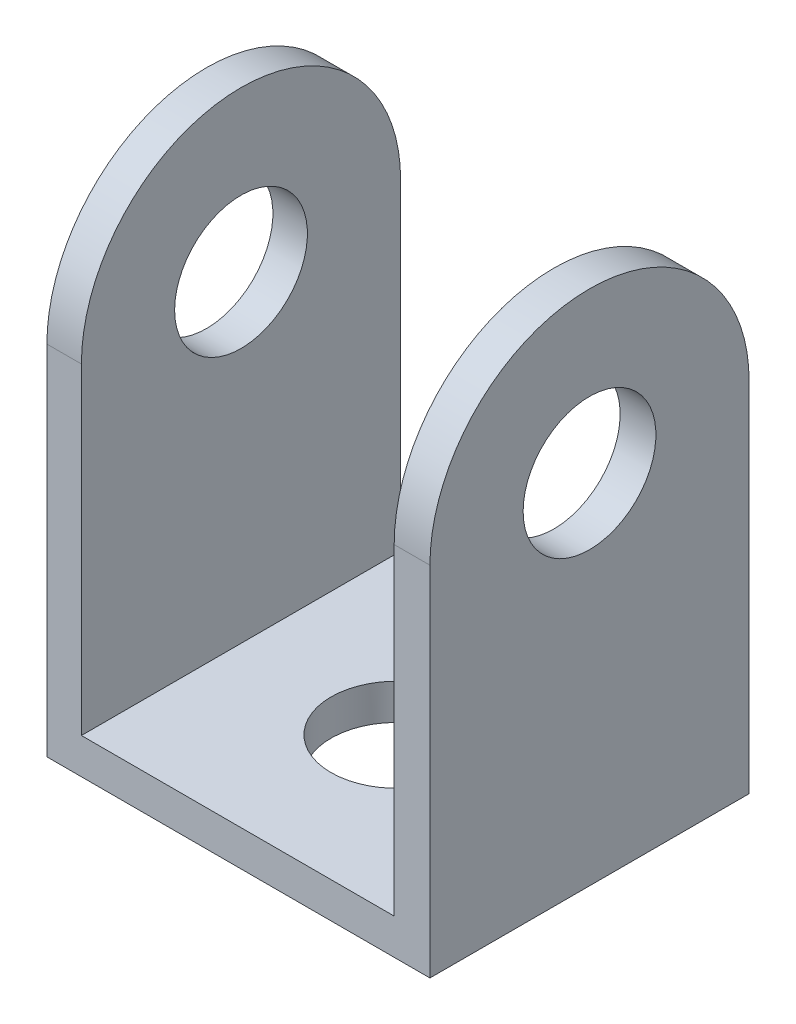
ISO-10303-21;
HEADER;
FILE_DESCRIPTION(('STEP AP214'),'2;1');
FILE_NAME('part.step','',(''),(''),'','','');
FILE_SCHEMA(('AUTOMOTIVE_DESIGN { 1 0 10303 214 1 1 1 1 }'));
ENDSEC;
DATA;
#1=APPLICATION_CONTEXT('core data for automotive mechanical design processes');
#2=APPLICATION_PROTOCOL_DEFINITION('international standard','automotive_design',2000,#1);
#3=PRODUCT_CONTEXT('',#1,'mechanical');
#4=PRODUCT('Part','Part','',(#3));
#5=PRODUCT_RELATED_PRODUCT_CATEGORY('part','',(#4));
#6=PRODUCT_DEFINITION_FORMATION('','',#4);
#7=PRODUCT_DEFINITION_CONTEXT('part definition',#1,'design');
#8=PRODUCT_DEFINITION('design','',#6,#7);
#9=PRODUCT_DEFINITION_SHAPE('','',#8);
#10=(LENGTH_UNIT() NAMED_UNIT(*) SI_UNIT(.MILLI.,.METRE.));
#11=(NAMED_UNIT(*) PLANE_ANGLE_UNIT() SI_UNIT($,.RADIAN.));
#12=(NAMED_UNIT(*) SI_UNIT($,.STERADIAN.) SOLID_ANGLE_UNIT());
#13=UNCERTAINTY_MEASURE_WITH_UNIT(LENGTH_MEASURE(1.E-05),#10,'distance_accuracy_value','');
#14=(GEOMETRIC_REPRESENTATION_CONTEXT(3) GLOBAL_UNCERTAINTY_ASSIGNED_CONTEXT((#13)) GLOBAL_UNIT_ASSIGNED_CONTEXT((#10,
#11,#12)) REPRESENTATION_CONTEXT('',''));
#15=CARTESIAN_POINT('',(0.,0.,0.));
#16=DIRECTION('',(0.,0.,1.));
#17=DIRECTION('',(1.,0.,0.));
#18=AXIS2_PLACEMENT_3D('',#15,#16,#17);
#19=CARTESIAN_POINT('',(19.05,0.,0.));
#20=DIRECTION('',(-1.,0.,0.));
#21=DIRECTION('',(0.,0.,1.));
#22=AXIS2_PLACEMENT_3D('',#19,#20,#21);
#23=CYLINDRICAL_SURFACE('',#22,7.9375);
#24=DIRECTION('',(-1.,0.,0.));
#25=VECTOR('',#24,1.);
#26=CARTESIAN_POINT('',(19.05,0.,-7.9375));
#27=LINE('',#26,#25);
#28=CARTESIAN_POINT('',(19.05,0.,-7.9375));
#29=VERTEX_POINT('',#28);
#30=CARTESIAN_POINT('',(17.272,0.,-7.9375));
#31=VERTEX_POINT('',#30);
#32=EDGE_CURVE('E51',#29,#31,#27,.T.);
#33=ORIENTED_EDGE('',*,*,#32,.T.);
#34=CARTESIAN_POINT('',(17.272,0.,0.));
#35=DIRECTION('',(1.,0.,0.));
#36=DIRECTION('',(0.,0.,-1.));
#37=AXIS2_PLACEMENT_3D('',#34,#35,#36);
#38=CIRCLE('',#37,7.9375);
#39=CARTESIAN_POINT('',(17.272,0.,7.9375));
#40=VERTEX_POINT('',#39);
#41=EDGE_CURVE('E148',#31,#40,#38,.T.);
#42=ORIENTED_EDGE('',*,*,#41,.T.);
#43=DIRECTION('',(-1.,0.,0.));
#44=VECTOR('',#43,1.);
#45=CARTESIAN_POINT('',(19.05,0.,7.9375));
#46=LINE('',#45,#44);
#47=CARTESIAN_POINT('',(19.05,0.,7.9375));
#48=VERTEX_POINT('',#47);
#49=EDGE_CURVE('E176',#48,#40,#46,.T.);
#50=ORIENTED_EDGE('',*,*,#49,.F.);
#51=CARTESIAN_POINT('',(19.05,0.,0.));
#52=DIRECTION('',(1.,0.,0.));
#53=DIRECTION('',(0.,0.,-1.));
#54=AXIS2_PLACEMENT_3D('',#51,#52,#53);
#55=CIRCLE('',#54,7.9375);
#56=EDGE_CURVE('E96',#29,#48,#55,.T.);
#57=ORIENTED_EDGE('',*,*,#56,.F.);
#58=EDGE_LOOP('',(#33,#42,#50,#57));
#59=FACE_BOUND('',#58,.T.);
#60=ADVANCED_FACE('F42',(#59),#23,.T.);
#61=CARTESIAN_POINT('',(19.05,0.,0.));
#62=DIRECTION('',(-1.,0.,0.));
#63=DIRECTION('',(0.,0.,1.));
#64=AXIS2_PLACEMENT_3D('',#61,#62,#63);
#65=CYLINDRICAL_SURFACE('',#64,3.302);
#66=CARTESIAN_POINT('',(17.272,0.,0.));
#67=DIRECTION('',(1.,0.,0.));
#68=DIRECTION('',(0.,0.,-1.));
#69=AXIS2_PLACEMENT_3D('',#66,#67,#68);
#70=CIRCLE('',#69,3.302);
#71=CARTESIAN_POINT('',(17.272,0.,3.302));
#72=VERTEX_POINT('',#71);
#73=EDGE_CURVE('E138',#72,#72,#70,.T.);
#74=CARTESIAN_POINT('',(19.05,0.,0.));
#75=DIRECTION('',(1.,0.,0.));
#76=DIRECTION('',(0.,0.,-1.));
#77=AXIS2_PLACEMENT_3D('',#74,#75,#76);
#78=CIRCLE('',#77,3.302);
#79=CARTESIAN_POINT('',(19.05,0.,3.302));
#80=VERTEX_POINT('',#79);
#81=EDGE_CURVE('E159',#80,#80,#78,.T.);
#82=CARTESIAN_POINT('',(17.272,0.,3.302));
#83=CARTESIAN_POINT('',(17.2905208333333,0.,3.302));
#84=CARTESIAN_POINT('',(17.3090416666667,0.,3.302));
#85=CARTESIAN_POINT('',(17.3460833333333,0.,3.302));
#86=CARTESIAN_POINT('',(17.3646041666667,0.,3.302));
#87=CARTESIAN_POINT('',(17.4016458333333,0.,3.302));
#88=CARTESIAN_POINT('',(17.4201666666667,0.,3.302));
#89=CARTESIAN_POINT('',(17.4572083333333,0.,3.302));
#90=CARTESIAN_POINT('',(17.4757291666667,0.,3.302));
#91=CARTESIAN_POINT('',(17.5127708333333,0.,3.302));
#92=CARTESIAN_POINT('',(17.5312916666667,0.,3.302));
#93=CARTESIAN_POINT('',(17.5683333333333,0.,3.302));
#94=CARTESIAN_POINT('',(17.5868541666667,0.,3.302));
#95=CARTESIAN_POINT('',(17.6238958333333,0.,3.302));
#96=CARTESIAN_POINT('',(17.6424166666667,0.,3.302));
#97=CARTESIAN_POINT('',(17.6794583333333,0.,3.302));
#98=CARTESIAN_POINT('',(17.6979791666667,0.,3.302));
#99=CARTESIAN_POINT('',(17.7350208333333,0.,3.302));
#100=CARTESIAN_POINT('',(17.7535416666667,0.,3.302));
#101=CARTESIAN_POINT('',(17.7905833333333,0.,3.302));
#102=CARTESIAN_POINT('',(17.8091041666667,0.,3.302));
#103=CARTESIAN_POINT('',(17.8461458333333,0.,3.302));
#104=CARTESIAN_POINT('',(17.8646666666667,0.,3.302));
#105=CARTESIAN_POINT('',(17.9017083333333,0.,3.302));
#106=CARTESIAN_POINT('',(17.9202291666667,0.,3.302));
#107=CARTESIAN_POINT('',(17.9572708333333,0.,3.302));
#108=CARTESIAN_POINT('',(17.9757916666667,0.,3.302));
#109=CARTESIAN_POINT('',(18.0128333333333,0.,3.302));
#110=CARTESIAN_POINT('',(18.0313541666667,0.,3.302));
#111=CARTESIAN_POINT('',(18.0683958333333,0.,3.302));
#112=CARTESIAN_POINT('',(18.0869166666667,0.,3.302));
#113=CARTESIAN_POINT('',(18.1239583333333,0.,3.302));
#114=CARTESIAN_POINT('',(18.1424791666667,0.,3.302));
#115=CARTESIAN_POINT('',(18.1795208333333,0.,3.302));
#116=CARTESIAN_POINT('',(18.1980416666667,0.,3.302));
#117=CARTESIAN_POINT('',(18.2350833333333,0.,3.302));
#118=CARTESIAN_POINT('',(18.2536041666667,0.,3.302));
#119=CARTESIAN_POINT('',(18.2906458333333,0.,3.302));
#120=CARTESIAN_POINT('',(18.3091666666667,0.,3.302));
#121=CARTESIAN_POINT('',(18.3462083333333,0.,3.302));
#122=CARTESIAN_POINT('',(18.3647291666667,0.,3.302));
#123=CARTESIAN_POINT('',(18.4017708333333,0.,3.302));
#124=CARTESIAN_POINT('',(18.4202916666667,0.,3.302));
#125=CARTESIAN_POINT('',(18.4573333333333,0.,3.302));
#126=CARTESIAN_POINT('',(18.4758541666667,0.,3.302));
#127=CARTESIAN_POINT('',(18.5128958333333,0.,3.302));
#128=CARTESIAN_POINT('',(18.5314166666667,0.,3.302));
#129=CARTESIAN_POINT('',(18.5684583333333,0.,3.302));
#130=CARTESIAN_POINT('',(18.5869791666667,0.,3.302));
#131=CARTESIAN_POINT('',(18.6240208333333,0.,3.302));
#132=CARTESIAN_POINT('',(18.6425416666667,0.,3.302));
#133=CARTESIAN_POINT('',(18.6795833333333,0.,3.302));
#134=CARTESIAN_POINT('',(18.6981041666667,0.,3.302));
#135=CARTESIAN_POINT('',(18.7351458333333,0.,3.302));
#136=CARTESIAN_POINT('',(18.7536666666667,0.,3.302));
#137=CARTESIAN_POINT('',(18.7907083333333,0.,3.302));
#138=CARTESIAN_POINT('',(18.8092291666667,0.,3.302));
#139=CARTESIAN_POINT('',(18.8462708333333,0.,3.302));
#140=CARTESIAN_POINT('',(18.8647916666667,0.,3.302));
#141=CARTESIAN_POINT('',(18.9018333333333,0.,3.302));
#142=CARTESIAN_POINT('',(18.9203541666667,0.,3.302));
#143=CARTESIAN_POINT('',(18.9573958333333,0.,3.302));
#144=CARTESIAN_POINT('',(18.9759166666667,0.,3.302));
#145=CARTESIAN_POINT('',(19.0129583333333,0.,3.302));
#146=CARTESIAN_POINT('',(19.0314791666667,0.,3.302));
#147=CARTESIAN_POINT('',(19.05,0.,3.302));
#148=B_SPLINE_CURVE_WITH_KNOTS('',3,(#82,#83,#84,#85,#86,#87,#88,#89,#90,#91,#92,#93,#94,#95,
#96,#97,#98,#99,#100,#101,#102,#103,#104,#105,#106,#107,#108,#109,#110,#111,#112,#113,#114,#115,
#116,#117,#118,#119,#120,#121,#122,#123,#124,#125,#126,#127,#128,#129,#130,#131,#132,#133,#134,
#135,#136,#137,#138,#139,#140,#141,#142,#143,#144,#145,#146,#147),.UNSPECIFIED.,.F.,.F.,(4,2,2,
2,2,2,2,2,2,2,2,2,2,2,2,2,2,2,2,2,2,2,2,2,2,2,2,2,2,2,2,2,4),(0.,0.0555625000000018,0.111125,
0.166687500000002,0.22225,0.277812500000002,0.333375,0.388937500000002,0.4445,0.500062500000002,
0.555625000000001,0.611187500000002,0.666750000000001,0.722312500000002,0.777875000000001,
0.833437500000003,0.889000000000001,0.944562499999999,1.000125,1.0556875,1.11125,1.1668125,
1.222375,1.2779375,1.3335,1.3890625,1.444625,1.5001875,1.55575,1.6113125,1.666875,1.7224375,
1.778),.UNSPECIFIED.);
#149=EDGE_CURVE('BSEAM207',#72,#80,#148,.T.);
#150=ORIENTED_EDGE('',*,*,#73,.F.);
#151=ORIENTED_EDGE('',*,*,#81,.T.);
#152=ORIENTED_EDGE('',*,*,#149,.T.);
#153=ORIENTED_EDGE('',*,*,#149,.F.);
#154=EDGE_LOOP('',(#150,#152,#151,#153));
#155=FACE_BOUND('',#154,.T.);
#156=ADVANCED_FACE('F207',(#155),#65,.F.);
#157=CARTESIAN_POINT('',(19.05,0.,-7.9375));
#158=DIRECTION('',(0.,0.,1.));
#159=DIRECTION('',(0.,-1.,0.));
#160=AXIS2_PLACEMENT_3D('',#157,#158,#159);
#161=PLANE('',#160);
#162=DIRECTION('',(1.,0.,0.));
#163=VECTOR('',#162,1.);
#164=CARTESIAN_POINT('',(19.05,-16.002,-7.9375));
#165=LINE('',#164,#163);
#166=CARTESIAN_POINT('',(1.71697331779427,-16.002,-7.9375));
#167=VERTEX_POINT('',#166);
#168=CARTESIAN_POINT('',(17.272,-16.002,-7.9375));
#169=VERTEX_POINT('',#168);
#170=EDGE_CURVE('E119',#167,#169,#165,.T.);
#171=ORIENTED_EDGE('',*,*,#170,.T.);
#172=DIRECTION('',(0.,1.,0.));
#173=VECTOR('',#172,1.);
#174=CARTESIAN_POINT('',(17.272,0.,-7.9375));
#175=LINE('',#174,#173);
#176=EDGE_CURVE('E129',#169,#31,#175,.T.);
#177=ORIENTED_EDGE('',*,*,#176,.T.);
#178=ORIENTED_EDGE('',*,*,#32,.F.);
#179=DIRECTION('',(0.,1.,0.));
#180=VECTOR('',#179,1.);
#181=CARTESIAN_POINT('',(19.05,0.,-7.9375));
#182=LINE('',#181,#180);
#183=CARTESIAN_POINT('',(19.05,-17.78,-7.9375));
#184=VERTEX_POINT('',#183);
#185=EDGE_CURVE('E152',#184,#29,#182,.T.);
#186=ORIENTED_EDGE('',*,*,#185,.F.);
#187=DIRECTION('',(-1.,0.,0.));
#188=VECTOR('',#187,1.);
#189=CARTESIAN_POINT('',(19.05,-17.78,-7.9375));
#190=LINE('',#189,#188);
#191=CARTESIAN_POINT('',(0.,-17.78,-7.9375));
#192=VERTEX_POINT('',#191);
#193=EDGE_CURVE('E162',#184,#192,#190,.T.);
#194=ORIENTED_EDGE('',*,*,#193,.T.);
#195=DIRECTION('',(0.,1.,0.));
#196=VECTOR('',#195,1.);
#197=CARTESIAN_POINT('',(0.,0.,-7.9375));
#198=LINE('',#197,#196);
#199=CARTESIAN_POINT('',(0.,0.,-7.9375));
#200=VERTEX_POINT('',#199);
#201=EDGE_CURVE('E128',#192,#200,#198,.T.);
#202=ORIENTED_EDGE('',*,*,#201,.T.);
#203=CARTESIAN_POINT('',(1.71697331779427,0.,-7.9375));
#204=VERTEX_POINT('',#203);
#205=EDGE_CURVE('E137',#204,#200,#27,.T.);
#206=ORIENTED_EDGE('',*,*,#205,.F.);
#207=DIRECTION('',(0.,-1.,0.));
#208=VECTOR('',#207,1.);
#209=CARTESIAN_POINT('',(1.71697331779427,0.,-7.9375));
#210=LINE('',#209,#208);
#211=EDGE_CURVE('E132',#204,#167,#210,.T.);
#212=ORIENTED_EDGE('',*,*,#211,.T.);
#213=EDGE_LOOP('',(#171,#177,#178,#186,#194,#202,#206,#212));
#214=FACE_BOUND('',#213,.T.);
#215=ADVANCED_FACE('F44',(#214),#161,.F.);
#216=CARTESIAN_POINT('',(1.71697331779427,0.,7.9375));
#217=VERTEX_POINT('',#216);
#218=CARTESIAN_POINT('',(0.,0.,7.9375));
#219=VERTEX_POINT('',#218);
#220=EDGE_CURVE('E175',#217,#219,#46,.T.);
#221=ORIENTED_EDGE('',*,*,#220,.F.);
#222=CARTESIAN_POINT('',(1.71697331779427,0.,0.));
#223=DIRECTION('',(-1.,0.,0.));
#224=DIRECTION('',(0.,0.,1.));
#225=AXIS2_PLACEMENT_3D('',#222,#223,#224);
#226=CIRCLE('',#225,7.9375);
#227=EDGE_CURVE('E58',#217,#204,#226,.T.);
#228=ORIENTED_EDGE('',*,*,#227,.T.);
#229=ORIENTED_EDGE('',*,*,#205,.T.);
#230=CARTESIAN_POINT('',(0.,0.,0.));
#231=DIRECTION('',(1.,0.,0.));
#232=DIRECTION('',(0.,0.,-1.));
#233=AXIS2_PLACEMENT_3D('',#230,#231,#232);
#234=CIRCLE('',#233,7.9375);
#235=EDGE_CURVE('E164',#200,#219,#234,.T.);
#236=ORIENTED_EDGE('',*,*,#235,.T.);
#237=EDGE_LOOP('',(#221,#228,#229,#236));
#238=FACE_BOUND('',#237,.T.);
#239=ADVANCED_FACE('F208',(#238),#23,.T.);
#240=CARTESIAN_POINT('',(19.05,0.,7.9375));
#241=DIRECTION('',(0.,0.,-1.));
#242=DIRECTION('',(0.,1.,0.));
#243=AXIS2_PLACEMENT_3D('',#240,#241,#242);
#244=PLANE('',#243);
#245=ORIENTED_EDGE('',*,*,#49,.T.);
#246=DIRECTION('',(0.,-1.,0.));
#247=VECTOR('',#246,1.);
#248=CARTESIAN_POINT('',(17.272,0.,7.9375));
#249=LINE('',#248,#247);
#250=CARTESIAN_POINT('',(17.272,-16.002,7.9375));
#251=VERTEX_POINT('',#250);
#252=EDGE_CURVE('E141',#40,#251,#249,.T.);
#253=ORIENTED_EDGE('',*,*,#252,.T.);
#254=DIRECTION('',(-1.,0.,0.));
#255=VECTOR('',#254,1.);
#256=CARTESIAN_POINT('',(19.05,-16.002,7.9375));
#257=LINE('',#256,#255);
#258=CARTESIAN_POINT('',(1.71697331779427,-16.002,7.9375));
#259=VERTEX_POINT('',#258);
#260=EDGE_CURVE('E11',#251,#259,#257,.T.);
#261=ORIENTED_EDGE('',*,*,#260,.T.);
#262=DIRECTION('',(0.,1.,0.));
#263=VECTOR('',#262,1.);
#264=CARTESIAN_POINT('',(1.71697331779427,0.,7.9375));
#265=LINE('',#264,#263);
#266=EDGE_CURVE('E133',#259,#217,#265,.T.);
#267=ORIENTED_EDGE('',*,*,#266,.T.);
#268=ORIENTED_EDGE('',*,*,#220,.T.);
#269=DIRECTION('',(0.,-1.,0.));
#270=VECTOR('',#269,1.);
#271=CARTESIAN_POINT('',(0.,0.,7.9375));
#272=LINE('',#271,#270);
#273=CARTESIAN_POINT('',(0.,-17.78,7.9375));
#274=VERTEX_POINT('',#273);
#275=EDGE_CURVE('E167',#219,#274,#272,.T.);
#276=ORIENTED_EDGE('',*,*,#275,.T.);
#277=DIRECTION('',(-1.,0.,0.));
#278=VECTOR('',#277,1.);
#279=CARTESIAN_POINT('',(19.05,-17.78,7.9375));
#280=LINE('',#279,#278);
#281=CARTESIAN_POINT('',(19.05,-17.78,7.9375));
#282=VERTEX_POINT('',#281);
#283=EDGE_CURVE('E173',#282,#274,#280,.T.);
#284=ORIENTED_EDGE('',*,*,#283,.F.);
#285=DIRECTION('',(0.,-1.,0.));
#286=VECTOR('',#285,1.);
#287=CARTESIAN_POINT('',(19.05,0.,7.9375));
#288=LINE('',#287,#286);
#289=EDGE_CURVE('E156',#48,#282,#288,.T.);
#290=ORIENTED_EDGE('',*,*,#289,.F.);
#291=EDGE_LOOP('',(#245,#253,#261,#267,#268,#276,#284,#290));
#292=FACE_BOUND('',#291,.T.);
#293=ADVANCED_FACE('F218',(#292),#244,.F.);
#294=CARTESIAN_POINT('',(19.05,-17.78,0.));
#295=DIRECTION('',(0.,1.,0.));
#296=DIRECTION('',(0.,0.,1.));
#297=AXIS2_PLACEMENT_3D('',#294,#295,#296);
#298=PLANE('',#297);
#299=CARTESIAN_POINT('',(9.525,-17.78,0.0634999999999993));
#300=DIRECTION('',(0.,1.,0.));
#301=DIRECTION('',(0.,0.,1.));
#302=AXIS2_PLACEMENT_3D('',#299,#300,#301);
#303=CIRCLE('',#302,3.2639);
#304=CARTESIAN_POINT('',(9.525,-17.78,3.3274));
#305=VERTEX_POINT('',#304);
#306=EDGE_CURVE('E187',#305,#305,#303,.T.);
#307=ORIENTED_EDGE('',*,*,#306,.T.);
#308=EDGE_LOOP('',(#307));
#309=FACE_BOUND('',#308,.T.);
#310=DIRECTION('',(0.,0.,-1.));
#311=VECTOR('',#310,1.);
#312=CARTESIAN_POINT('',(0.,-17.78,0.));
#313=LINE('',#312,#311);
#314=EDGE_CURVE('E88',#274,#192,#313,.T.);
#315=ORIENTED_EDGE('',*,*,#314,.T.);
#316=ORIENTED_EDGE('',*,*,#193,.F.);
#317=DIRECTION('',(0.,0.,-1.));
#318=VECTOR('',#317,1.);
#319=CARTESIAN_POINT('',(19.05,-17.78,0.));
#320=LINE('',#319,#318);
#321=EDGE_CURVE('E67',#282,#184,#320,.T.);
#322=ORIENTED_EDGE('',*,*,#321,.F.);
#323=ORIENTED_EDGE('',*,*,#283,.T.);
#324=EDGE_LOOP('',(#315,#316,#322,#323));
#325=FACE_BOUND('',#324,.T.);
#326=ADVANCED_FACE('F224',(#309,#325),#298,.F.);
#327=CARTESIAN_POINT('',(1.71697331779427,0.,0.));
#328=DIRECTION('',(-1.,0.,0.));
#329=DIRECTION('',(0.,0.,1.));
#330=AXIS2_PLACEMENT_3D('',#327,#328,#329);
#331=CIRCLE('',#330,3.302);
#332=CARTESIAN_POINT('',(1.71697331779427,0.,3.302));
#333=VERTEX_POINT('',#332);
#334=EDGE_CURVE('E180',#333,#333,#331,.T.);
#335=CARTESIAN_POINT('',(0.,0.,0.));
#336=DIRECTION('',(1.,0.,0.));
#337=DIRECTION('',(0.,0.,-1.));
#338=AXIS2_PLACEMENT_3D('',#335,#336,#337);
#339=CIRCLE('',#338,3.302);
#340=CARTESIAN_POINT('',(0.,0.,3.302));
#341=VERTEX_POINT('',#340);
#342=EDGE_CURVE('E154',#341,#341,#339,.T.);
#343=CARTESIAN_POINT('',(1.71697331779427,0.,3.302));
#344=CARTESIAN_POINT('',(1.69908817906724,0.,3.302));
#345=CARTESIAN_POINT('',(1.68120304034022,0.,3.302));
#346=CARTESIAN_POINT('',(1.64543276288617,0.,3.302));
#347=CARTESIAN_POINT('',(1.62754762415915,0.,3.302));
#348=CARTESIAN_POINT('',(1.5917773467051,0.,3.302));
#349=CARTESIAN_POINT('',(1.57389220797808,0.,3.302));
#350=CARTESIAN_POINT('',(1.53812193052403,0.,3.302));
#351=CARTESIAN_POINT('',(1.52023679179701,0.,3.302));
#352=CARTESIAN_POINT('',(1.48446651434296,0.,3.302));
#353=CARTESIAN_POINT('',(1.46658137561594,0.,3.302));
#354=CARTESIAN_POINT('',(1.43081109816189,0.,3.302));
#355=CARTESIAN_POINT('',(1.41292595943487,0.,3.302));
#356=CARTESIAN_POINT('',(1.37715568198082,0.,3.302));
#357=CARTESIAN_POINT('',(1.35927054325379,0.,3.302));
#358=CARTESIAN_POINT('',(1.32350026579975,0.,3.302));
#359=CARTESIAN_POINT('',(1.30561512707272,0.,3.302));
#360=CARTESIAN_POINT('',(1.26984484961868,0.,3.302));
#361=CARTESIAN_POINT('',(1.25195971089165,0.,3.302));
#362=CARTESIAN_POINT('',(1.21618943343761,0.,3.302));
#363=CARTESIAN_POINT('',(1.19830429471058,0.,3.302));
#364=CARTESIAN_POINT('',(1.16253401725653,0.,3.302));
#365=CARTESIAN_POINT('',(1.14464887852951,0.,3.302));
#366=CARTESIAN_POINT('',(1.10887860107546,0.,3.302));
#367=CARTESIAN_POINT('',(1.09099346234844,0.,3.302));
#368=CARTESIAN_POINT('',(1.05522318489439,0.,3.302));
#369=CARTESIAN_POINT('',(1.03733804616737,0.,3.302));
#370=CARTESIAN_POINT('',(1.00156776871332,0.,3.302));
#371=CARTESIAN_POINT('',(0.983682629986298,0.,3.302));
#372=CARTESIAN_POINT('',(0.947912352532251,0.,3.302));
#373=CARTESIAN_POINT('',(0.930027213805228,0.,3.302));
#374=CARTESIAN_POINT('',(0.894256936351181,0.,3.302));
#375=CARTESIAN_POINT('',(0.876371797624157,0.,3.302));
#376=CARTESIAN_POINT('',(0.840601520170109,0.,3.302));
#377=CARTESIAN_POINT('',(0.822716381443085,0.,3.302));
#378=CARTESIAN_POINT('',(0.786946103989039,0.,3.302));
#379=CARTESIAN_POINT('',(0.769060965262016,0.,3.302));
#380=CARTESIAN_POINT('',(0.733290687807969,0.,3.302));
#381=CARTESIAN_POINT('',(0.715405549080945,0.,3.302));
#382=CARTESIAN_POINT('',(0.679635271626897,0.,3.302));
#383=CARTESIAN_POINT('',(0.661750132899873,0.,3.302));
#384=CARTESIAN_POINT('',(0.625979855445826,0.,3.302));
#385=CARTESIAN_POINT('',(0.608094716718804,0.,3.302));
#386=CARTESIAN_POINT('',(0.572324439264757,0.,3.302));
#387=CARTESIAN_POINT('',(0.554439300537733,0.,3.302));
#388=CARTESIAN_POINT('',(0.518669023083685,0.,3.302));
#389=CARTESIAN_POINT('',(0.500783884356661,0.,3.302));
#390=CARTESIAN_POINT('',(0.465013606902614,0.,3.302));
#391=CARTESIAN_POINT('',(0.447128468175591,0.,3.302));
#392=CARTESIAN_POINT('',(0.411358190721544,0.,3.302));
#393=CARTESIAN_POINT('',(0.39347305199452,0.,3.302));
#394=CARTESIAN_POINT('',(0.357702774540473,0.,3.302));
#395=CARTESIAN_POINT('',(0.339817635813449,0.,3.302));
#396=CARTESIAN_POINT('',(0.304047358359401,0.,3.302));
#397=CARTESIAN_POINT('',(0.286162219632377,0.,3.302));
#398=CARTESIAN_POINT('',(0.25039194217833,0.,3.302));
#399=CARTESIAN_POINT('',(0.232506803451307,0.,3.302));
#400=CARTESIAN_POINT('',(0.19673652599726,0.,3.302));
#401=CARTESIAN_POINT('',(0.178851387270236,0.,3.302));
#402=CARTESIAN_POINT('',(0.143081109816188,0.,3.302));
#403=CARTESIAN_POINT('',(0.125195971089164,0.,3.302));
#404=CARTESIAN_POINT('',(0.0894256936351176,0.,3.302));
#405=CARTESIAN_POINT('',(0.0715405549080947,0.,3.302));
#406=CARTESIAN_POINT('',(0.0357702774540479,0.,3.302));
#407=CARTESIAN_POINT('',(0.017885138727024,0.,3.302));
#408=CARTESIAN_POINT('',(0.,0.,3.302));
#409=B_SPLINE_CURVE_WITH_KNOTS('',3,(#343,#344,#345,#346,#347,#348,#349,#350,#351,#352,#353,
#354,#355,#356,#357,#358,#359,#360,#361,#362,#363,#364,#365,#366,#367,#368,#369,#370,#371,#372,
#373,#374,#375,#376,#377,#378,#379,#380,#381,#382,#383,#384,#385,#386,#387,#388,#389,#390,#391,
#392,#393,#394,#395,#396,#397,#398,#399,#400,#401,#402,#403,#404,#405,#406,#407,#408),
.UNSPECIFIED.,.F.,.F.,(4,2,2,2,2,2,2,2,2,2,2,2,2,2,2,2,2,2,2,2,2,2,2,2,2,2,2,2,2,2,2,2,4),(0.,
0.0536554161810719,0.10731083236214,0.160966248543212,0.214621664724284,0.268277080905353,
0.321932497086425,0.375587913267497,0.429243329448568,0.482898745629637,0.536554161810709,
0.590209577991781,0.643864994172849,0.697520410353921,0.751175826534993,0.804831242716061,
0.858486658897133,0.912142075078205,0.965797491259274,1.01945290744035,1.07310832362142,
1.12676373980249,1.18041915598356,1.23407457216463,1.2877299883457,1.34138540452677,
1.39504082070784,1.44869623688891,1.50235165306998,1.55600706925105,1.60966248543213,
1.66331790161319,1.71697331779427),.UNSPECIFIED.);
#410=EDGE_CURVE('BSEAM215',#333,#341,#409,.T.);
#411=ORIENTED_EDGE('',*,*,#334,.F.);
#412=ORIENTED_EDGE('',*,*,#342,.F.);
#413=ORIENTED_EDGE('',*,*,#410,.T.);
#414=ORIENTED_EDGE('',*,*,#410,.F.);
#415=EDGE_LOOP('',(#411,#413,#412,#414));
#416=FACE_BOUND('',#415,.T.);
#417=ADVANCED_FACE('F215',(#416),#65,.F.);
#418=CARTESIAN_POINT('',(19.05,0.,0.));
#419=DIRECTION('',(1.,0.,0.));
#420=DIRECTION('',(0.,0.,-1.));
#421=AXIS2_PLACEMENT_3D('',#418,#419,#420);
#422=PLANE('',#421);
#423=ORIENTED_EDGE('',*,*,#185,.T.);
#424=ORIENTED_EDGE('',*,*,#56,.T.);
#425=ORIENTED_EDGE('',*,*,#289,.T.);
#426=ORIENTED_EDGE('',*,*,#321,.T.);
#427=EDGE_LOOP('',(#423,#424,#425,#426));
#428=FACE_BOUND('',#427,.T.);
#429=ORIENTED_EDGE('',*,*,#81,.F.);
#430=EDGE_LOOP('',(#429));
#431=FACE_BOUND('',#430,.T.);
#432=ADVANCED_FACE('F234',(#428,#431),#422,.T.);
#433=CARTESIAN_POINT('',(0.,0.,0.));
#434=DIRECTION('',(1.,0.,0.));
#435=DIRECTION('',(0.,0.,-1.));
#436=AXIS2_PLACEMENT_3D('',#433,#434,#435);
#437=PLANE('',#436);
#438=ORIENTED_EDGE('',*,*,#201,.F.);
#439=ORIENTED_EDGE('',*,*,#314,.F.);
#440=ORIENTED_EDGE('',*,*,#275,.F.);
#441=ORIENTED_EDGE('',*,*,#235,.F.);
#442=EDGE_LOOP('',(#438,#439,#440,#441));
#443=FACE_BOUND('',#442,.T.);
#444=ORIENTED_EDGE('',*,*,#342,.T.);
#445=EDGE_LOOP('',(#444));
#446=FACE_BOUND('',#445,.T.);
#447=ADVANCED_FACE('F243',(#443,#446),#437,.F.);
#448=CARTESIAN_POINT('',(1.71697331779427,-16.002,-12.7));
#449=DIRECTION('',(0.,-1.,0.));
#450=DIRECTION('',(0.,0.,-1.));
#451=AXIS2_PLACEMENT_3D('',#448,#449,#450);
#452=PLANE('',#451);
#453=CARTESIAN_POINT('',(9.525,-16.002,0.0634999999999993));
#454=DIRECTION('',(0.,-1.,0.));
#455=DIRECTION('',(0.,0.,-1.));
#456=AXIS2_PLACEMENT_3D('',#453,#454,#455);
#457=CIRCLE('',#456,3.2639);
#458=CARTESIAN_POINT('',(9.525,-16.002,-3.2004));
#459=VERTEX_POINT('',#458);
#460=EDGE_CURVE('E46',#459,#459,#457,.T.);
#461=ORIENTED_EDGE('',*,*,#460,.T.);
#462=EDGE_LOOP('',(#461));
#463=FACE_BOUND('',#462,.T.);
#464=DIRECTION('',(0.,0.,1.));
#465=VECTOR('',#464,1.);
#466=CARTESIAN_POINT('',(1.71697331779427,-16.002,-12.7));
#467=LINE('',#466,#465);
#468=EDGE_CURVE('E122',#167,#259,#467,.T.);
#469=ORIENTED_EDGE('',*,*,#468,.T.);
#470=ORIENTED_EDGE('',*,*,#260,.F.);
#471=DIRECTION('',(0.,0.,1.));
#472=VECTOR('',#471,1.);
#473=CARTESIAN_POINT('',(17.272,-16.002,-12.7));
#474=LINE('',#473,#472);
#475=EDGE_CURVE('E124',#169,#251,#474,.T.);
#476=ORIENTED_EDGE('',*,*,#475,.F.);
#477=ORIENTED_EDGE('',*,*,#170,.F.);
#478=EDGE_LOOP('',(#469,#470,#476,#477));
#479=FACE_BOUND('',#478,.T.);
#480=ADVANCED_FACE('F121',(#463,#479),#452,.F.);
#481=CARTESIAN_POINT('',(17.272,-16.002,-12.7));
#482=DIRECTION('',(1.,0.,0.));
#483=DIRECTION('',(0.,0.,-1.));
#484=AXIS2_PLACEMENT_3D('',#481,#482,#483);
#485=PLANE('',#484);
#486=ORIENTED_EDGE('',*,*,#73,.T.);
#487=EDGE_LOOP('',(#486));
#488=FACE_BOUND('',#487,.T.);
#489=ORIENTED_EDGE('',*,*,#475,.T.);
#490=ORIENTED_EDGE('',*,*,#252,.F.);
#491=ORIENTED_EDGE('',*,*,#41,.F.);
#492=ORIENTED_EDGE('',*,*,#176,.F.);
#493=EDGE_LOOP('',(#489,#490,#491,#492));
#494=FACE_BOUND('',#493,.T.);
#495=ADVANCED_FACE('F203',(#488,#494),#485,.F.);
#496=CARTESIAN_POINT('',(1.71697331779427,-16.002,-12.7));
#497=DIRECTION('',(-1.,0.,0.));
#498=DIRECTION('',(0.,0.,1.));
#499=AXIS2_PLACEMENT_3D('',#496,#497,#498);
#500=PLANE('',#499);
#501=ORIENTED_EDGE('',*,*,#334,.T.);
#502=EDGE_LOOP('',(#501));
#503=FACE_BOUND('',#502,.T.);
#504=ORIENTED_EDGE('',*,*,#227,.F.);
#505=ORIENTED_EDGE('',*,*,#266,.F.);
#506=ORIENTED_EDGE('',*,*,#468,.F.);
#507=ORIENTED_EDGE('',*,*,#211,.F.);
#508=EDGE_LOOP('',(#504,#505,#506,#507));
#509=FACE_BOUND('',#508,.T.);
#510=ADVANCED_FACE('F131',(#503,#509),#500,.F.);
#511=CARTESIAN_POINT('',(9.525,-17.78,0.0634999999999993));
#512=DIRECTION('',(0.,1.,0.));
#513=DIRECTION('',(0.,0.,1.));
#514=AXIS2_PLACEMENT_3D('',#511,#512,#513);
#515=CYLINDRICAL_SURFACE('',#514,3.2639);
#516=ORIENTED_EDGE('',*,*,#306,.F.);
#517=EDGE_LOOP('',(#516));
#518=FACE_BOUND('',#517,.T.);
#519=ORIENTED_EDGE('',*,*,#460,.F.);
#520=EDGE_LOOP('',(#519));
#521=FACE_BOUND('',#520,.T.);
#522=ADVANCED_FACE('F195',(#518,#521),#515,.F.);
#523=CLOSED_SHELL('',(#60,#156,#215,#239,#293,#326,#417,#432,#447,#480,#495,#510,#522));
#524=MANIFOLD_SOLID_BREP('B2',#523);
#525=ADVANCED_BREP_SHAPE_REPRESENTATION('',(#18,#524),#14);
#526=SHAPE_DEFINITION_REPRESENTATION(#9,#525);
ENDSEC;
END-ISO-10303-21;
